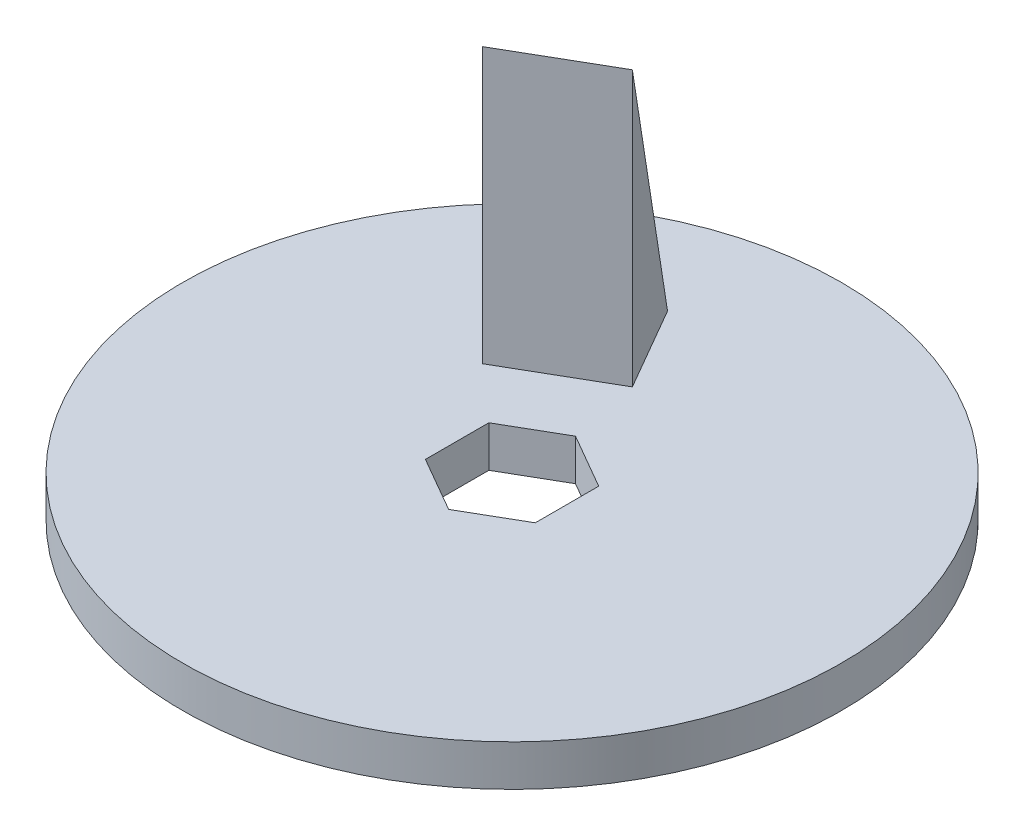
ISO-10303-21;
HEADER;
FILE_DESCRIPTION(('STEP AP214'),'2;1');
FILE_NAME('part.step','',(''),(''),'','','');
FILE_SCHEMA(('AUTOMOTIVE_DESIGN { 1 0 10303 214 1 1 1 1 }'));
ENDSEC;
DATA;
#1=APPLICATION_CONTEXT('core data for automotive mechanical design processes');
#2=APPLICATION_PROTOCOL_DEFINITION('international standard','automotive_design',2000,#1);
#3=PRODUCT_CONTEXT('',#1,'mechanical');
#4=PRODUCT('Part','Part','',(#3));
#5=PRODUCT_RELATED_PRODUCT_CATEGORY('part','',(#4));
#6=PRODUCT_DEFINITION_FORMATION('','',#4);
#7=PRODUCT_DEFINITION_CONTEXT('part definition',#1,'design');
#8=PRODUCT_DEFINITION('design','',#6,#7);
#9=PRODUCT_DEFINITION_SHAPE('','',#8);
#10=(LENGTH_UNIT() NAMED_UNIT(*) SI_UNIT(.MILLI.,.METRE.));
#11=(NAMED_UNIT(*) PLANE_ANGLE_UNIT() SI_UNIT($,.RADIAN.));
#12=(NAMED_UNIT(*) SI_UNIT($,.STERADIAN.) SOLID_ANGLE_UNIT());
#13=UNCERTAINTY_MEASURE_WITH_UNIT(LENGTH_MEASURE(1.E-05),#10,'distance_accuracy_value','');
#14=(GEOMETRIC_REPRESENTATION_CONTEXT(3) GLOBAL_UNCERTAINTY_ASSIGNED_CONTEXT((#13)) GLOBAL_UNIT_ASSIGNED_CONTEXT((#10,
#11,#12)) REPRESENTATION_CONTEXT('',''));
#15=CARTESIAN_POINT('',(0.,0.,0.));
#16=DIRECTION('',(0.,0.,1.));
#17=DIRECTION('',(1.,0.,0.));
#18=AXIS2_PLACEMENT_3D('',#15,#16,#17);
#19=CARTESIAN_POINT('',(0.,19.05,0.));
#20=DIRECTION('',(0.,1.,0.));
#21=DIRECTION('',(0.,0.,1.));
#22=AXIS2_PLACEMENT_3D('',#19,#20,#21);
#23=PLANE('',#22);
#24=DIRECTION('',(0.866025403784439,0.,-0.5));
#25=VECTOR('',#24,1.);
#26=CARTESIAN_POINT('',(-50.8,19.05,-87.988181024499));
#27=LINE('',#26,#25);
#28=CARTESIAN_POINT('',(-72.7970452561248,19.05,-75.288181024499));
#29=VERTEX_POINT('',#28);
#30=CARTESIAN_POINT('',(-28.8029547438753,19.05,-100.688181024499));
#31=VERTEX_POINT('',#30);
#32=EDGE_CURVE('E200',#29,#31,#27,.T.);
#33=ORIENTED_EDGE('',*,*,#32,.T.);
#34=DIRECTION('',(0.5,0.,0.866025403784439));
#35=VECTOR('',#34,1.);
#36=CARTESIAN_POINT('',(21.9970452561248,19.05,-12.7));
#37=LINE('',#36,#35);
#38=CARTESIAN_POINT('',(-6.57795474387523,19.05,-62.1933518262807));
#39=VERTEX_POINT('',#38);
#40=EDGE_CURVE('E204',#31,#39,#37,.T.);
#41=ORIENTED_EDGE('',*,*,#40,.T.);
#42=DIRECTION('',(0.866025403784439,0.,-0.5));
#43=VECTOR('',#42,1.);
#44=CARTESIAN_POINT('',(-28.575,19.05,-49.4933518262807));
#45=LINE('',#44,#43);
#46=CARTESIAN_POINT('',(-50.5720452561247,19.05,-36.7933518262807));
#47=VERTEX_POINT('',#46);
#48=EDGE_CURVE('E57',#47,#39,#45,.T.);
#49=ORIENTED_EDGE('',*,*,#48,.F.);
#50=DIRECTION('',(-0.5,0.,-0.866025403784439));
#51=VECTOR('',#50,1.);
#52=CARTESIAN_POINT('',(-21.9970452561247,19.05,12.7));
#53=LINE('',#52,#51);
#54=EDGE_CURVE('E209',#47,#29,#53,.T.);
#55=ORIENTED_EDGE('',*,*,#54,.T.);
#56=EDGE_LOOP('',(#33,#41,#49,#55));
#57=FACE_BOUND('',#56,.T.);
#58=CARTESIAN_POINT('',(0.,19.05,0.));
#59=DIRECTION('',(0.,1.,0.));
#60=DIRECTION('',(0.,0.,1.));
#61=AXIS2_PLACEMENT_3D('',#58,#59,#60);
#62=CIRCLE('',#61,152.4);
#63=CARTESIAN_POINT('',(0.,19.05,-152.4));
#64=VERTEX_POINT('',#63);
#65=EDGE_CURVE('E165',#64,#64,#62,.T.);
#66=ORIENTED_EDGE('',*,*,#65,.T.);
#67=EDGE_LOOP('',(#66));
#68=FACE_BOUND('',#67,.T.);
#69=DIRECTION('',(-0.866025403784439,0.,-0.5));
#70=VECTOR('',#69,1.);
#71=CARTESIAN_POINT('',(12.7,19.05,-21.9970452561248));
#72=LINE('',#71,#70);
#73=CARTESIAN_POINT('',(25.4,19.05,-14.6646968374165));
#74=VERTEX_POINT('',#73);
#75=CARTESIAN_POINT('',(0.,19.05,-29.329393674833));
#76=VERTEX_POINT('',#75);
#77=EDGE_CURVE('E182',#74,#76,#72,.T.);
#78=ORIENTED_EDGE('',*,*,#77,.F.);
#79=DIRECTION('',(0.,0.,-1.));
#80=VECTOR('',#79,1.);
#81=CARTESIAN_POINT('',(25.4,19.05,0.));
#82=LINE('',#81,#80);
#83=CARTESIAN_POINT('',(25.4,19.05,14.6646968374165));
#84=VERTEX_POINT('',#83);
#85=EDGE_CURVE('E183',#84,#74,#82,.T.);
#86=ORIENTED_EDGE('',*,*,#85,.F.);
#87=DIRECTION('',(0.866025403784439,0.,-0.5));
#88=VECTOR('',#87,1.);
#89=CARTESIAN_POINT('',(12.7,19.05,21.9970452561247));
#90=LINE('',#89,#88);
#91=CARTESIAN_POINT('',(0.,19.05,29.329393674833));
#92=VERTEX_POINT('',#91);
#93=EDGE_CURVE('E129',#92,#84,#90,.T.);
#94=ORIENTED_EDGE('',*,*,#93,.F.);
#95=DIRECTION('',(0.866025403784439,0.,0.5));
#96=VECTOR('',#95,1.);
#97=CARTESIAN_POINT('',(-12.7,19.05,21.9970452561247));
#98=LINE('',#97,#96);
#99=CARTESIAN_POINT('',(-25.4,19.05,14.6646968374165));
#100=VERTEX_POINT('',#99);
#101=EDGE_CURVE('E111',#100,#92,#98,.T.);
#102=ORIENTED_EDGE('',*,*,#101,.F.);
#103=DIRECTION('',(0.,0.,1.));
#104=VECTOR('',#103,1.);
#105=CARTESIAN_POINT('',(-25.4,19.05,0.));
#106=LINE('',#105,#104);
#107=CARTESIAN_POINT('',(-25.4,19.05,-14.6646968374165));
#108=VERTEX_POINT('',#107);
#109=EDGE_CURVE('E126',#108,#100,#106,.T.);
#110=ORIENTED_EDGE('',*,*,#109,.F.);
#111=DIRECTION('',(-0.866025403784439,0.,0.5));
#112=VECTOR('',#111,1.);
#113=CARTESIAN_POINT('',(-12.7,19.05,-21.9970452561248));
#114=LINE('',#113,#112);
#115=EDGE_CURVE('E134',#76,#108,#114,.T.);
#116=ORIENTED_EDGE('',*,*,#115,.F.);
#117=EDGE_LOOP('',(#78,#86,#94,#102,#110,#116));
#118=FACE_BOUND('',#117,.T.);
#119=ADVANCED_FACE('F41',(#57,#68,#118),#23,.T.);
#120=CARTESIAN_POINT('',(12.7,19.05,-21.9970452561248));
#121=DIRECTION('',(-0.5,0.,0.866025403784439));
#122=DIRECTION('',(0.866025403784439,0.,0.5));
#123=AXIS2_PLACEMENT_3D('',#120,#121,#122);
#124=PLANE('',#123);
#125=DIRECTION('',(-0.866025403784439,0.,-0.5));
#126=VECTOR('',#125,1.);
#127=CARTESIAN_POINT('',(12.7,0.,-21.9970452561248));
#128=LINE('',#127,#126);
#129=CARTESIAN_POINT('',(25.4,0.,-14.6646968374165));
#130=VERTEX_POINT('',#129);
#131=CARTESIAN_POINT('',(0.,0.,-29.329393674833));
#132=VERTEX_POINT('',#131);
#133=EDGE_CURVE('E144',#130,#132,#128,.T.);
#134=ORIENTED_EDGE('',*,*,#133,.F.);
#135=DIRECTION('',(0.,-1.,0.));
#136=VECTOR('',#135,1.);
#137=CARTESIAN_POINT('',(25.4,19.05,-14.6646968374165));
#138=LINE('',#137,#136);
#139=EDGE_CURVE('E11',#74,#130,#138,.T.);
#140=ORIENTED_EDGE('',*,*,#139,.F.);
#141=ORIENTED_EDGE('',*,*,#77,.T.);
#142=DIRECTION('',(0.,-1.,0.));
#143=VECTOR('',#142,1.);
#144=CARTESIAN_POINT('',(0.,19.05,-29.329393674833));
#145=LINE('',#144,#143);
#146=EDGE_CURVE('E66',#76,#132,#145,.T.);
#147=ORIENTED_EDGE('',*,*,#146,.T.);
#148=EDGE_LOOP('',(#134,#140,#141,#147));
#149=FACE_BOUND('',#148,.T.);
#150=ADVANCED_FACE('F246',(#149),#124,.T.);
#151=CARTESIAN_POINT('',(25.4,19.05,0.));
#152=DIRECTION('',(-1.,0.,0.));
#153=DIRECTION('',(0.,0.,1.));
#154=AXIS2_PLACEMENT_3D('',#151,#152,#153);
#155=PLANE('',#154);
#156=DIRECTION('',(0.,0.,-1.));
#157=VECTOR('',#156,1.);
#158=CARTESIAN_POINT('',(25.4,0.,0.));
#159=LINE('',#158,#157);
#160=CARTESIAN_POINT('',(25.4,0.,14.6646968374165));
#161=VERTEX_POINT('',#160);
#162=EDGE_CURVE('E148',#161,#130,#159,.T.);
#163=ORIENTED_EDGE('',*,*,#162,.F.);
#164=DIRECTION('',(0.,-1.,0.));
#165=VECTOR('',#164,1.);
#166=CARTESIAN_POINT('',(25.4,19.05,14.6646968374165));
#167=LINE('',#166,#165);
#168=EDGE_CURVE('E50',#84,#161,#167,.T.);
#169=ORIENTED_EDGE('',*,*,#168,.F.);
#170=ORIENTED_EDGE('',*,*,#85,.T.);
#171=ORIENTED_EDGE('',*,*,#139,.T.);
#172=EDGE_LOOP('',(#163,#169,#170,#171));
#173=FACE_BOUND('',#172,.T.);
#174=ADVANCED_FACE('F178',(#173),#155,.T.);
#175=CARTESIAN_POINT('',(12.7,19.05,21.9970452561247));
#176=DIRECTION('',(-0.5,0.,-0.866025403784439));
#177=DIRECTION('',(-0.866025403784439,0.,0.5));
#178=AXIS2_PLACEMENT_3D('',#175,#176,#177);
#179=PLANE('',#178);
#180=DIRECTION('',(0.866025403784439,0.,-0.5));
#181=VECTOR('',#180,1.);
#182=CARTESIAN_POINT('',(12.7,0.,21.9970452561247));
#183=LINE('',#182,#181);
#184=CARTESIAN_POINT('',(0.,0.,29.329393674833));
#185=VERTEX_POINT('',#184);
#186=EDGE_CURVE('E152',#185,#161,#183,.T.);
#187=ORIENTED_EDGE('',*,*,#186,.F.);
#188=DIRECTION('',(0.,-1.,0.));
#189=VECTOR('',#188,1.);
#190=CARTESIAN_POINT('',(0.,19.05,29.329393674833));
#191=LINE('',#190,#189);
#192=EDGE_CURVE('E119',#92,#185,#191,.T.);
#193=ORIENTED_EDGE('',*,*,#192,.F.);
#194=ORIENTED_EDGE('',*,*,#93,.T.);
#195=ORIENTED_EDGE('',*,*,#168,.T.);
#196=EDGE_LOOP('',(#187,#193,#194,#195));
#197=FACE_BOUND('',#196,.T.);
#198=ADVANCED_FACE('F175',(#197),#179,.T.);
#199=CARTESIAN_POINT('',(-12.7,19.05,21.9970452561247));
#200=DIRECTION('',(0.5,0.,-0.866025403784439));
#201=DIRECTION('',(-0.866025403784438,0.,-0.5));
#202=AXIS2_PLACEMENT_3D('',#199,#200,#201);
#203=PLANE('',#202);
#204=DIRECTION('',(0.866025403784439,0.,0.5));
#205=VECTOR('',#204,1.);
#206=CARTESIAN_POINT('',(-12.7,0.,21.9970452561247));
#207=LINE('',#206,#205);
#208=CARTESIAN_POINT('',(-25.4,0.,14.6646968374165));
#209=VERTEX_POINT('',#208);
#210=EDGE_CURVE('E113',#209,#185,#207,.T.);
#211=ORIENTED_EDGE('',*,*,#210,.F.);
#212=DIRECTION('',(0.,-1.,0.));
#213=VECTOR('',#212,1.);
#214=CARTESIAN_POINT('',(-25.4,19.05,14.6646968374165));
#215=LINE('',#214,#213);
#216=EDGE_CURVE('E108',#100,#209,#215,.T.);
#217=ORIENTED_EDGE('',*,*,#216,.F.);
#218=ORIENTED_EDGE('',*,*,#101,.T.);
#219=ORIENTED_EDGE('',*,*,#192,.T.);
#220=EDGE_LOOP('',(#211,#217,#218,#219));
#221=FACE_BOUND('',#220,.T.);
#222=ADVANCED_FACE('F110',(#221),#203,.T.);
#223=CARTESIAN_POINT('',(-25.4,19.05,0.));
#224=DIRECTION('',(1.,0.,0.));
#225=DIRECTION('',(0.,0.,-1.));
#226=AXIS2_PLACEMENT_3D('',#223,#224,#225);
#227=PLANE('',#226);
#228=DIRECTION('',(0.,0.,1.));
#229=VECTOR('',#228,1.);
#230=CARTESIAN_POINT('',(-25.4,0.,0.));
#231=LINE('',#230,#229);
#232=CARTESIAN_POINT('',(-25.4,0.,-14.6646968374165));
#233=VERTEX_POINT('',#232);
#234=EDGE_CURVE('E158',#233,#209,#231,.T.);
#235=ORIENTED_EDGE('',*,*,#234,.F.);
#236=DIRECTION('',(0.,-1.,0.));
#237=VECTOR('',#236,1.);
#238=CARTESIAN_POINT('',(-25.4,19.05,-14.6646968374165));
#239=LINE('',#238,#237);
#240=EDGE_CURVE('E120',#108,#233,#239,.T.);
#241=ORIENTED_EDGE('',*,*,#240,.F.);
#242=ORIENTED_EDGE('',*,*,#109,.T.);
#243=ORIENTED_EDGE('',*,*,#216,.T.);
#244=EDGE_LOOP('',(#235,#241,#242,#243));
#245=FACE_BOUND('',#244,.T.);
#246=ADVANCED_FACE('F132',(#245),#227,.T.);
#247=CARTESIAN_POINT('',(0.,19.05,0.));
#248=DIRECTION('',(0.,-1.,0.));
#249=DIRECTION('',(0.,0.,-1.));
#250=AXIS2_PLACEMENT_3D('',#247,#248,#249);
#251=CYLINDRICAL_SURFACE('',#250,152.4);
#252=CARTESIAN_POINT('',(0.,0.,0.));
#253=DIRECTION('',(0.,1.,0.));
#254=DIRECTION('',(0.,0.,1.));
#255=AXIS2_PLACEMENT_3D('',#252,#253,#254);
#256=CIRCLE('',#255,152.4);
#257=CARTESIAN_POINT('',(0.,0.,-152.4));
#258=VERTEX_POINT('',#257);
#259=EDGE_CURVE('E140',#258,#258,#256,.T.);
#260=CARTESIAN_POINT('',(0.,19.05,-152.4));
#261=CARTESIAN_POINT('',(0.,18.8515625,-152.4));
#262=CARTESIAN_POINT('',(0.,18.653125,-152.4));
#263=CARTESIAN_POINT('',(0.,18.25625,-152.4));
#264=CARTESIAN_POINT('',(0.,18.0578125,-152.4));
#265=CARTESIAN_POINT('',(0.,17.6609375,-152.4));
#266=CARTESIAN_POINT('',(0.,17.4625,-152.4));
#267=CARTESIAN_POINT('',(0.,17.065625,-152.4));
#268=CARTESIAN_POINT('',(0.,16.8671875,-152.4));
#269=CARTESIAN_POINT('',(0.,16.4703125,-152.4));
#270=CARTESIAN_POINT('',(0.,16.271875,-152.4));
#271=CARTESIAN_POINT('',(0.,15.875,-152.4));
#272=CARTESIAN_POINT('',(0.,15.6765625,-152.4));
#273=CARTESIAN_POINT('',(0.,15.2796875,-152.4));
#274=CARTESIAN_POINT('',(0.,15.08125,-152.4));
#275=CARTESIAN_POINT('',(0.,14.684375,-152.4));
#276=CARTESIAN_POINT('',(0.,14.4859375,-152.4));
#277=CARTESIAN_POINT('',(0.,14.0890625,-152.4));
#278=CARTESIAN_POINT('',(0.,13.890625,-152.4));
#279=CARTESIAN_POINT('',(0.,13.49375,-152.4));
#280=CARTESIAN_POINT('',(0.,13.2953125,-152.4));
#281=CARTESIAN_POINT('',(0.,12.8984375,-152.4));
#282=CARTESIAN_POINT('',(0.,12.7,-152.4));
#283=CARTESIAN_POINT('',(0.,12.303125,-152.4));
#284=CARTESIAN_POINT('',(0.,12.1046875,-152.4));
#285=CARTESIAN_POINT('',(0.,11.7078125,-152.4));
#286=CARTESIAN_POINT('',(0.,11.509375,-152.4));
#287=CARTESIAN_POINT('',(0.,11.1125,-152.4));
#288=CARTESIAN_POINT('',(0.,10.9140625,-152.4));
#289=CARTESIAN_POINT('',(0.,10.5171875,-152.4));
#290=CARTESIAN_POINT('',(0.,10.31875,-152.4));
#291=CARTESIAN_POINT('',(0.,9.921875,-152.4));
#292=CARTESIAN_POINT('',(0.,9.7234375,-152.4));
#293=CARTESIAN_POINT('',(0.,9.3265625,-152.4));
#294=CARTESIAN_POINT('',(0.,9.128125,-152.4));
#295=CARTESIAN_POINT('',(0.,8.73125,-152.4));
#296=CARTESIAN_POINT('',(0.,8.5328125,-152.4));
#297=CARTESIAN_POINT('',(0.,8.1359375,-152.4));
#298=CARTESIAN_POINT('',(0.,7.9375,-152.4));
#299=CARTESIAN_POINT('',(0.,7.540625,-152.4));
#300=CARTESIAN_POINT('',(0.,7.3421875,-152.4));
#301=CARTESIAN_POINT('',(0.,6.9453125,-152.4));
#302=CARTESIAN_POINT('',(0.,6.746875,-152.4));
#303=CARTESIAN_POINT('',(0.,6.35,-152.4));
#304=CARTESIAN_POINT('',(0.,6.1515625,-152.4));
#305=CARTESIAN_POINT('',(0.,5.7546875,-152.4));
#306=CARTESIAN_POINT('',(0.,5.55625,-152.4));
#307=CARTESIAN_POINT('',(0.,5.159375,-152.4));
#308=CARTESIAN_POINT('',(0.,4.9609375,-152.4));
#309=CARTESIAN_POINT('',(0.,4.5640625,-152.4));
#310=CARTESIAN_POINT('',(0.,4.365625,-152.4));
#311=CARTESIAN_POINT('',(0.,3.96875,-152.4));
#312=CARTESIAN_POINT('',(0.,3.7703125,-152.4));
#313=CARTESIAN_POINT('',(0.,3.3734375,-152.4));
#314=CARTESIAN_POINT('',(0.,3.175,-152.4));
#315=CARTESIAN_POINT('',(0.,2.778125,-152.4));
#316=CARTESIAN_POINT('',(0.,2.5796875,-152.4));
#317=CARTESIAN_POINT('',(0.,2.1828125,-152.4));
#318=CARTESIAN_POINT('',(0.,1.984375,-152.4));
#319=CARTESIAN_POINT('',(0.,1.5875,-152.4));
#320=CARTESIAN_POINT('',(0.,1.3890625,-152.4));
#321=CARTESIAN_POINT('',(0.,0.992187500000001,-152.4));
#322=CARTESIAN_POINT('',(0.,0.793750000000001,-152.4));
#323=CARTESIAN_POINT('',(0.,0.396875,-152.4));
#324=CARTESIAN_POINT('',(0.,0.1984375,-152.4));
#325=CARTESIAN_POINT('',(0.,0.,-152.4));
#326=B_SPLINE_CURVE_WITH_KNOTS('',3,(#260,#261,#262,#263,#264,#265,#266,#267,#268,#269,#270,
#271,#272,#273,#274,#275,#276,#277,#278,#279,#280,#281,#282,#283,#284,#285,#286,#287,#288,#289,
#290,#291,#292,#293,#294,#295,#296,#297,#298,#299,#300,#301,#302,#303,#304,#305,#306,#307,#308,
#309,#310,#311,#312,#313,#314,#315,#316,#317,#318,#319,#320,#321,#322,#323,#324,#325),
.UNSPECIFIED.,.F.,.F.,(4,2,2,2,2,2,2,2,2,2,2,2,2,2,2,2,2,2,2,2,2,2,2,2,2,2,2,2,2,2,2,2,4),(0.,
0.5953125,1.190625,1.7859375,2.38125,2.9765625,3.571875,4.1671875,4.7625,5.3578125,5.953125,
6.5484375,7.14375,7.7390625,8.334375,8.9296875,9.525,10.1203125,10.715625,11.3109375,11.90625,
12.5015625,13.096875,13.6921875,14.2875,14.8828125,15.478125,16.0734375,16.66875,17.2640625,
17.859375,18.4546875,19.05),.UNSPECIFIED.);
#327=EDGE_CURVE('BSEAM43',#64,#258,#326,.T.);
#328=ORIENTED_EDGE('',*,*,#65,.F.);
#329=ORIENTED_EDGE('',*,*,#259,.T.);
#330=ORIENTED_EDGE('',*,*,#327,.T.);
#331=ORIENTED_EDGE('',*,*,#327,.F.);
#332=EDGE_LOOP('',(#328,#330,#329,#331));
#333=FACE_BOUND('',#332,.T.);
#334=ADVANCED_FACE('F43',(#333),#251,.T.);
#335=CARTESIAN_POINT('',(-12.7,19.05,-21.9970452561248));
#336=DIRECTION('',(0.5,0.,0.866025403784439));
#337=DIRECTION('',(0.866025403784439,0.,-0.5));
#338=AXIS2_PLACEMENT_3D('',#335,#336,#337);
#339=PLANE('',#338);
#340=DIRECTION('',(-0.866025403784439,0.,0.5));
#341=VECTOR('',#340,1.);
#342=CARTESIAN_POINT('',(-12.7,0.,-21.9970452561248));
#343=LINE('',#342,#341);
#344=EDGE_CURVE('E161',#132,#233,#343,.T.);
#345=ORIENTED_EDGE('',*,*,#344,.F.);
#346=ORIENTED_EDGE('',*,*,#146,.F.);
#347=ORIENTED_EDGE('',*,*,#115,.T.);
#348=ORIENTED_EDGE('',*,*,#240,.T.);
#349=EDGE_LOOP('',(#345,#346,#347,#348));
#350=FACE_BOUND('',#349,.T.);
#351=ADVANCED_FACE('F181',(#350),#339,.T.);
#352=CARTESIAN_POINT('',(0.,0.,0.));
#353=DIRECTION('',(0.,1.,0.));
#354=DIRECTION('',(0.,0.,1.));
#355=AXIS2_PLACEMENT_3D('',#352,#353,#354);
#356=PLANE('',#355);
#357=ORIENTED_EDGE('',*,*,#259,.F.);
#358=EDGE_LOOP('',(#357));
#359=FACE_BOUND('',#358,.T.);
#360=ORIENTED_EDGE('',*,*,#133,.T.);
#361=ORIENTED_EDGE('',*,*,#344,.T.);
#362=ORIENTED_EDGE('',*,*,#234,.T.);
#363=ORIENTED_EDGE('',*,*,#210,.T.);
#364=ORIENTED_EDGE('',*,*,#186,.T.);
#365=ORIENTED_EDGE('',*,*,#162,.T.);
#366=EDGE_LOOP('',(#360,#361,#362,#363,#364,#365));
#367=FACE_BOUND('',#366,.T.);
#368=ADVANCED_FACE('F180',(#359,#367),#356,.F.);
#369=CARTESIAN_POINT('',(-21.9970452561247,146.05,12.7));
#370=DIRECTION('',(-0.866025403784439,0.,0.5));
#371=DIRECTION('',(0.5,0.,0.866025403784439));
#372=AXIS2_PLACEMENT_3D('',#369,#370,#371);
#373=PLANE('',#372);
#374=DIRECTION('',(0.165175212364053,0.943858356366017,0.286091859965519));
#375=VECTOR('',#374,1.);
#376=CARTESIAN_POINT('',(-50.5720452561248,146.05,-36.7933518262807));
#377=LINE('',#376,#375);
#378=CARTESIAN_POINT('',(-50.5720452561247,146.05,-36.7933518262807));
#379=VERTEX_POINT('',#378);
#380=EDGE_CURVE('E219',#29,#379,#377,.T.);
#381=ORIENTED_EDGE('',*,*,#380,.F.);
#382=ORIENTED_EDGE('',*,*,#54,.F.);
#383=DIRECTION('',(0.,-1.,0.));
#384=VECTOR('',#383,1.);
#385=CARTESIAN_POINT('',(-50.5720452561247,146.05,-36.7933518262807));
#386=LINE('',#385,#384);
#387=EDGE_CURVE('E145',#379,#47,#386,.T.);
#388=ORIENTED_EDGE('',*,*,#387,.F.);
#389=EDGE_LOOP('',(#381,#382,#388));
#390=FACE_BOUND('',#389,.T.);
#391=ADVANCED_FACE('F233',(#390),#373,.T.);
#392=CARTESIAN_POINT('',(-28.575,146.05,-49.4933518262807));
#393=DIRECTION('',(-0.5,0.,-0.866025403784439));
#394=DIRECTION('',(-0.866025403784439,0.,0.5));
#395=AXIS2_PLACEMENT_3D('',#392,#393,#394);
#396=PLANE('',#395);
#397=ORIENTED_EDGE('',*,*,#48,.T.);
#398=DIRECTION('',(0.,-1.,0.));
#399=VECTOR('',#398,1.);
#400=CARTESIAN_POINT('',(-6.57795474387523,146.05,-62.1933518262807));
#401=LINE('',#400,#399);
#402=CARTESIAN_POINT('',(-6.57795474387524,146.05,-62.1933518262807));
#403=VERTEX_POINT('',#402);
#404=EDGE_CURVE('E195',#403,#39,#401,.T.);
#405=ORIENTED_EDGE('',*,*,#404,.F.);
#406=DIRECTION('',(0.866025403784439,0.,-0.5));
#407=VECTOR('',#406,1.);
#408=CARTESIAN_POINT('',(-28.575,146.05,-49.4933518262807));
#409=LINE('',#408,#407);
#410=EDGE_CURVE('E199',#379,#403,#409,.T.);
#411=ORIENTED_EDGE('',*,*,#410,.F.);
#412=ORIENTED_EDGE('',*,*,#387,.T.);
#413=EDGE_LOOP('',(#397,#405,#411,#412));
#414=FACE_BOUND('',#413,.T.);
#415=ADVANCED_FACE('F236',(#414),#396,.F.);
#416=CARTESIAN_POINT('',(21.9970452561248,146.05,-12.7));
#417=DIRECTION('',(0.866025403784439,0.,-0.5));
#418=DIRECTION('',(-0.5,0.,-0.866025403784439));
#419=AXIS2_PLACEMENT_3D('',#416,#417,#418);
#420=PLANE('',#419);
#421=DIRECTION('',(-0.165175212364053,-0.943858356366018,-0.286091859965519));
#422=VECTOR('',#421,1.);
#423=CARTESIAN_POINT('',(-3.45952489977725,163.869599109131,-56.7920728964639));
#424=LINE('',#423,#422);
#425=EDGE_CURVE('E212',#403,#31,#424,.T.);
#426=ORIENTED_EDGE('',*,*,#425,.F.);
#427=ORIENTED_EDGE('',*,*,#404,.T.);
#428=ORIENTED_EDGE('',*,*,#40,.F.);
#429=EDGE_LOOP('',(#426,#427,#428));
#430=FACE_BOUND('',#429,.T.);
#431=ADVANCED_FACE('F241',(#430),#420,.T.);
#432=CARTESIAN_POINT('',(151.716135768374,146.05,-153.584487594655));
#433=DIRECTION('',(0.471929178183009,-0.330350424728106,0.817405314187197));
#434=DIRECTION('',(0.866025403784439,0.,-0.5));
#435=AXIS2_PLACEMENT_3D('',#432,#433,#434);
#436=PLANE('',#435);
#437=ORIENTED_EDGE('',*,*,#425,.T.);
#438=ORIENTED_EDGE('',*,*,#32,.F.);
#439=ORIENTED_EDGE('',*,*,#380,.T.);
#440=ORIENTED_EDGE('',*,*,#410,.T.);
#441=EDGE_LOOP('',(#437,#438,#439,#440));
#442=FACE_BOUND('',#441,.T.);
#443=ADVANCED_FACE('F226',(#442),#436,.F.);
#444=CLOSED_SHELL('',(#119,#150,#174,#198,#222,#246,#334,#351,#368,#391,#415,#431,#443));
#445=MANIFOLD_SOLID_BREP('B2',#444);
#446=ADVANCED_BREP_SHAPE_REPRESENTATION('',(#18,#445),#14);
#447=SHAPE_DEFINITION_REPRESENTATION(#9,#446);
ENDSEC;
END-ISO-10303-21;
